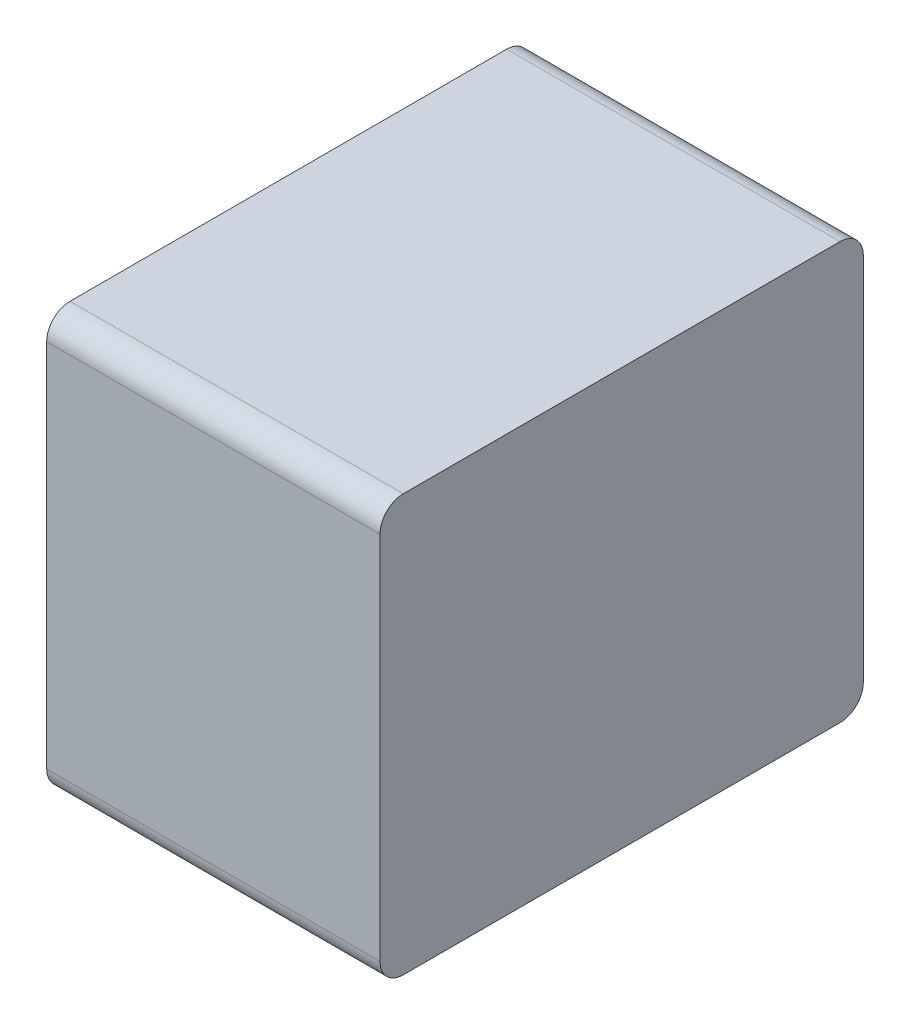
ISO-10303-21;
HEADER;
FILE_DESCRIPTION(('STEP AP214'),'2;1');
FILE_NAME('part.step','',(''),(''),'','','');
FILE_SCHEMA(('AUTOMOTIVE_DESIGN { 1 0 10303 214 1 1 1 1 }'));
ENDSEC;
DATA;
#1=APPLICATION_CONTEXT('core data for automotive mechanical design processes');
#2=APPLICATION_PROTOCOL_DEFINITION('international standard','automotive_design',2000,#1);
#3=PRODUCT_CONTEXT('',#1,'mechanical');
#4=PRODUCT('Part','Part','',(#3));
#5=PRODUCT_RELATED_PRODUCT_CATEGORY('part','',(#4));
#6=PRODUCT_DEFINITION_FORMATION('','',#4);
#7=PRODUCT_DEFINITION_CONTEXT('part definition',#1,'design');
#8=PRODUCT_DEFINITION('design','',#6,#7);
#9=PRODUCT_DEFINITION_SHAPE('','',#8);
#10=(LENGTH_UNIT() NAMED_UNIT(*) SI_UNIT(.MILLI.,.METRE.));
#11=(NAMED_UNIT(*) PLANE_ANGLE_UNIT() SI_UNIT($,.RADIAN.));
#12=(NAMED_UNIT(*) SI_UNIT($,.STERADIAN.) SOLID_ANGLE_UNIT());
#13=UNCERTAINTY_MEASURE_WITH_UNIT(LENGTH_MEASURE(1.E-05),#10,'distance_accuracy_value','');
#14=(GEOMETRIC_REPRESENTATION_CONTEXT(3) GLOBAL_UNCERTAINTY_ASSIGNED_CONTEXT((#13)) GLOBAL_UNIT_ASSIGNED_CONTEXT((#10,
#11,#12)) REPRESENTATION_CONTEXT('',''));
#15=CARTESIAN_POINT('',(0.,0.,0.));
#16=DIRECTION('',(0.,0.,1.));
#17=DIRECTION('',(1.,0.,0.));
#18=AXIS2_PLACEMENT_3D('',#15,#16,#17);
#19=CARTESIAN_POINT('',(13.800002391758,3.300002498851,-2.336602067947));
#20=DIRECTION('',(-0.999999999999996,8.74227765734797E-08,0.));
#21=DIRECTION('',(-8.74227765734797E-08,-0.999999999999996,0.));
#22=AXIS2_PLACEMENT_3D('',#19,#20,#21);
#23=PLANE('',#22);
#24=CARTESIAN_POINT('',(13.8000023432386,2.74500255611239,-2.991602116467));
#25=DIRECTION('',(0.999999999999996,-8.74227765734797E-08,0.));
#26=DIRECTION('',(8.74227765734797E-08,0.999999999999996,0.));
#27=AXIS2_PLACEMENT_3D('',#24,#25,#26);
#28=CIRCLE('',#27,0.07);
#29=CARTESIAN_POINT('',(13.800002337119,2.67500255611223,-2.9916021225868));
#30=VERTEX_POINT('',#29);
#31=CARTESIAN_POINT('',(13.8000023432383,2.7450025185205,-3.061602116467));
#32=VERTEX_POINT('',#31);
#33=EDGE_CURVE('E101',#30,#32,#28,.T.);
#34=ORIENTED_EDGE('',*,*,#33,.F.);
#35=DIRECTION('',(0.,8.74227766794096E-08,-0.999999999999996));
#36=VECTOR('',#35,1.);
#37=CARTESIAN_POINT('',(13.800002337119,2.67500244158839,-1.681602122587));
#38=LINE('',#37,#36);
#39=CARTESIAN_POINT('',(13.8000023371187,2.67500244158839,-1.6816021225868));
#40=VERTEX_POINT('',#39);
#41=EDGE_CURVE('E83',#40,#30,#38,.T.);
#42=ORIENTED_EDGE('',*,*,#41,.F.);
#43=CARTESIAN_POINT('',(13.800002343238,2.74500244158839,-1.681602116467));
#44=DIRECTION('',(0.999999999999996,-8.74227765734797E-08,0.));
#45=DIRECTION('',(8.74227765734797E-08,0.999999999999996,0.));
#46=AXIS2_PLACEMENT_3D('',#43,#44,#45);
#47=CIRCLE('',#46,0.07);
#48=CARTESIAN_POINT('',(13.8000023917575,2.74500243546878,-1.61160211646721));
#49=VERTEX_POINT('',#48);
#50=EDGE_CURVE('E20',#40,#49,#47,.F.);
#51=ORIENTED_EDGE('',*,*,#50,.T.);
#52=DIRECTION('',(0.,-0.999999999999996,-8.74227765851997E-08));
#53=VECTOR('',#52,1.);
#54=CARTESIAN_POINT('',(13.800002440277,3.855002391758,-1.611602019428));
#55=LINE('',#54,#53);
#56=CARTESIAN_POINT('',(13.8000024402772,3.8550023917575,-1.611602019428));
#57=VERTEX_POINT('',#56);
#58=EDGE_CURVE('E80',#57,#49,#55,.T.);
#59=ORIENTED_EDGE('',*,*,#58,.F.);
#60=CARTESIAN_POINT('',(13.8000024402774,3.85500244158839,-1.681602019428));
#61=DIRECTION('',(0.999999999999996,-8.74227765734797E-08,0.));
#62=DIRECTION('',(8.74227765734797E-08,0.999999999999996,0.));
#63=AXIS2_PLACEMENT_3D('',#60,#61,#62);
#64=CIRCLE('',#63,0.07);
#65=CARTESIAN_POINT('',(13.800002446397,3.92500244158855,-1.6816020133082));
#66=VERTEX_POINT('',#65);
#67=EDGE_CURVE('E113',#66,#57,#64,.T.);
#68=ORIENTED_EDGE('',*,*,#67,.F.);
#69=DIRECTION('',(0.,-8.74227765734797E-08,0.999999999999996));
#70=VECTOR('',#69,1.);
#71=CARTESIAN_POINT('',(13.800002446397,3.92500255611239,-2.991602013308));
#72=LINE('',#71,#70);
#73=CARTESIAN_POINT('',(13.8000024463968,3.92500255611239,-2.9916020163682));
#74=VERTEX_POINT('',#73);
#75=EDGE_CURVE('E110',#74,#66,#72,.T.);
#76=ORIENTED_EDGE('',*,*,#75,.F.);
#77=CARTESIAN_POINT('',(13.800002440277,3.85500255611239,-2.991602019428));
#78=DIRECTION('',(0.999999999999996,-8.74227765734797E-08,0.));
#79=DIRECTION('',(8.74227765734797E-08,0.999999999999996,0.));
#80=AXIS2_PLACEMENT_3D('',#77,#78,#79);
#81=CIRCLE('',#80,0.07);
#82=CARTESIAN_POINT('',(13.8000023917575,3.85500256223189,-3.06160201942786));
#83=VERTEX_POINT('',#82);
#84=EDGE_CURVE('E107',#83,#74,#81,.T.);
#85=ORIENTED_EDGE('',*,*,#84,.F.);
#86=DIRECTION('',(0.,0.999999999999996,8.74227765734797E-08));
#87=VECTOR('',#86,1.);
#88=CARTESIAN_POINT('',(13.800002343238,2.745002518521,-3.061602116467));
#89=LINE('',#88,#87);
#90=EDGE_CURVE('E104',#32,#83,#89,.T.);
#91=ORIENTED_EDGE('',*,*,#90,.F.);
#92=EDGE_LOOP('',(#34,#42,#51,#59,#68,#76,#85,#91));
#93=FACE_BOUND('',#92,.T.);
#94=ADVANCED_FACE('F17',(#93),#23,.T.);
#95=CARTESIAN_POINT('',(14.300002440277,3.855002391758,-1.611602019428));
#96=DIRECTION('',(0.,-8.74227765851997E-08,0.999999999999996));
#97=DIRECTION('',(0.,-0.999999999999996,-8.74227765851997E-08));
#98=AXIS2_PLACEMENT_3D('',#95,#96,#97);
#99=PLANE('',#98);
#100=DIRECTION('',(0.999999999999996,-8.74227765734797E-08,0.));
#101=VECTOR('',#100,1.);
#102=CARTESIAN_POINT('',(14.300002440277,3.85500239175761,-1.611602019428));
#103=LINE('',#102,#101);
#104=CARTESIAN_POINT('',(14.800002440277,3.85500235110592,-1.6116020679475));
#105=VERTEX_POINT('',#104);
#106=EDGE_CURVE('E90',#57,#105,#103,.T.);
#107=ORIENTED_EDGE('',*,*,#106,.F.);
#108=ORIENTED_EDGE('',*,*,#58,.T.);
#109=DIRECTION('',(0.999999999999996,-8.74227765734797E-08,0.));
#110=VECTOR('',#109,1.);
#111=CARTESIAN_POINT('',(14.300002343238,2.74500239175739,-1.611602116467));
#112=LINE('',#111,#110);
#113=CARTESIAN_POINT('',(14.8000023432385,2.74500235110581,-1.611602116467));
#114=VERTEX_POINT('',#113);
#115=EDGE_CURVE('E89',#114,#49,#112,.F.);
#116=ORIENTED_EDGE('',*,*,#115,.F.);
#117=DIRECTION('',(-8.74227765734797E-08,-0.999999999999996,0.));
#118=VECTOR('',#117,1.);
#119=CARTESIAN_POINT('',(14.800002391758,3.300002411428,-1.611602116467));
#120=LINE('',#119,#118);
#121=EDGE_CURVE('E93',#114,#105,#120,.F.);
#122=ORIENTED_EDGE('',*,*,#121,.T.);
#123=EDGE_LOOP('',(#107,#108,#116,#122));
#124=FACE_BOUND('',#123,.T.);
#125=ADVANCED_FACE('F87',(#124),#99,.T.);
#126=CARTESIAN_POINT('',(14.300002440277,3.855002397877,-1.681602019428));
#127=DIRECTION('',(0.999999999999996,-8.74227765734797E-08,0.));
#128=DIRECTION('',(8.74227765734797E-08,0.999999999999996,0.));
#129=AXIS2_PLACEMENT_3D('',#126,#127,#128);
#130=CYLINDRICAL_SURFACE('',#129,0.07);
#131=DIRECTION('',(0.999999999999996,-8.7422776573479E-08,0.));
#132=VECTOR('',#131,1.);
#133=CARTESIAN_POINT('',(14.300002446397,3.92500239787716,-1.681602013308));
#134=LINE('',#133,#132);
#135=CARTESIAN_POINT('',(14.8000024463969,3.92500235416594,-1.68160201636801));
#136=VERTEX_POINT('',#135);
#137=EDGE_CURVE('E111',#66,#136,#134,.T.);
#138=ORIENTED_EDGE('',*,*,#137,.F.);
#139=ORIENTED_EDGE('',*,*,#67,.T.);
#140=ORIENTED_EDGE('',*,*,#106,.T.);
#141=CARTESIAN_POINT('',(14.800002440277,3.85500235416561,-1.681602019428));
#142=DIRECTION('',(0.999999999999996,-8.74227765734797E-08,0.));
#143=DIRECTION('',(8.74227765734797E-08,0.999999999999996,0.));
#144=AXIS2_PLACEMENT_3D('',#141,#142,#143);
#145=CIRCLE('',#144,0.07);
#146=EDGE_CURVE('E95',#105,#136,#145,.F.);
#147=ORIENTED_EDGE('',*,*,#146,.T.);
#148=EDGE_LOOP('',(#138,#139,#140,#147));
#149=FACE_BOUND('',#148,.T.);
#150=ADVANCED_FACE('F135',(#149),#130,.T.);
#151=CARTESIAN_POINT('',(14.300002446397,3.925002512401,-2.991602013308));
#152=DIRECTION('',(8.74227765734793E-08,0.999999999999992,8.74227765734793E-08));
#153=DIRECTION('',(0.,-8.74227765734797E-08,0.999999999999996));
#154=AXIS2_PLACEMENT_3D('',#151,#152,#153);
#155=PLANE('',#154);
#156=DIRECTION('',(0.999999999999996,-8.74227765734797E-08,0.));
#157=VECTOR('',#156,1.);
#158=CARTESIAN_POINT('',(14.3000024463966,3.925002512401,-2.991602019428));
#159=LINE('',#158,#157);
#160=CARTESIAN_POINT('',(14.800002446397,3.92500241142781,-2.991602019428));
#161=VERTEX_POINT('',#160);
#162=EDGE_CURVE('E108',#74,#161,#159,.T.);
#163=ORIENTED_EDGE('',*,*,#162,.F.);
#164=ORIENTED_EDGE('',*,*,#75,.T.);
#165=ORIENTED_EDGE('',*,*,#137,.T.);
#166=DIRECTION('',(0.,0.,1.));
#167=VECTOR('',#166,1.);
#168=CARTESIAN_POINT('',(14.8000024463972,3.925002354166,-2.336602067947));
#169=LINE('',#168,#167);
#170=EDGE_CURVE('E127',#136,#161,#169,.F.);
#171=ORIENTED_EDGE('',*,*,#170,.T.);
#172=EDGE_LOOP('',(#163,#164,#165,#171));
#173=FACE_BOUND('',#172,.T.);
#174=ADVANCED_FACE('F139',(#173),#155,.T.);
#175=CARTESIAN_POINT('',(14.300002440277,3.855002512401,-2.991602019428));
#176=DIRECTION('',(0.999999999999996,-8.74227765734797E-08,0.));
#177=DIRECTION('',(8.74227765734797E-08,0.999999999999996,0.));
#178=AXIS2_PLACEMENT_3D('',#175,#176,#177);
#179=CYLINDRICAL_SURFACE('',#178,0.07);
#180=DIRECTION('',(1.,0.,0.));
#181=VECTOR('',#180,1.);
#182=CARTESIAN_POINT('',(14.300002343238,3.855002562232,-3.06160201942771));
#183=LINE('',#182,#181);
#184=CARTESIAN_POINT('',(14.8000024402774,3.85500251546081,-3.06160201942786));
#185=VERTEX_POINT('',#184);
#186=EDGE_CURVE('E105',#83,#185,#183,.T.);
#187=ORIENTED_EDGE('',*,*,#186,.F.);
#188=ORIENTED_EDGE('',*,*,#84,.T.);
#189=ORIENTED_EDGE('',*,*,#162,.T.);
#190=CARTESIAN_POINT('',(14.8000024402774,3.85500246868961,-2.991602019428));
#191=DIRECTION('',(0.999999999999996,-8.74227765734797E-08,0.));
#192=DIRECTION('',(8.74227765734797E-08,0.999999999999996,0.));
#193=AXIS2_PLACEMENT_3D('',#190,#191,#192);
#194=CIRCLE('',#193,0.07);
#195=EDGE_CURVE('E124',#161,#185,#194,.F.);
#196=ORIENTED_EDGE('',*,*,#195,.T.);
#197=EDGE_LOOP('',(#187,#188,#189,#196));
#198=FACE_BOUND('',#197,.T.);
#199=ADVANCED_FACE('F145',(#198),#179,.T.);
#200=CARTESIAN_POINT('',(14.300002343238,2.745002518521,-3.061602116467));
#201=DIRECTION('',(0.,8.74227765734797E-08,-0.999999999999996));
#202=DIRECTION('',(0.,0.999999999999996,8.74227765734797E-08));
#203=AXIS2_PLACEMENT_3D('',#200,#201,#202);
#204=PLANE('',#203);
#205=DIRECTION('',(0.999999999999996,-8.74227765734797E-08,0.));
#206=VECTOR('',#205,1.);
#207=CARTESIAN_POINT('',(14.300002343238,2.74500251852061,-3.061602116467));
#208=LINE('',#207,#206);
#209=CARTESIAN_POINT('',(14.800002343238,2.74500247174942,-3.0616020679475));
#210=VERTEX_POINT('',#209);
#211=EDGE_CURVE('E102',#32,#210,#208,.T.);
#212=ORIENTED_EDGE('',*,*,#211,.F.);
#213=ORIENTED_EDGE('',*,*,#90,.T.);
#214=ORIENTED_EDGE('',*,*,#186,.T.);
#215=DIRECTION('',(-8.74227765734797E-08,-0.999999999999996,0.));
#216=VECTOR('',#215,1.);
#217=CARTESIAN_POINT('',(14.800002391758,3.300002411428,-3.061602019428));
#218=LINE('',#217,#216);
#219=EDGE_CURVE('E123',#185,#210,#218,.T.);
#220=ORIENTED_EDGE('',*,*,#219,.T.);
#221=EDGE_LOOP('',(#212,#213,#214,#220));
#222=FACE_BOUND('',#221,.T.);
#223=ADVANCED_FACE('F163',(#222),#204,.T.);
#224=CARTESIAN_POINT('',(14.300002343238,2.745002512401,-2.991602116467));
#225=DIRECTION('',(0.999999999999996,-8.74227765734797E-08,0.));
#226=DIRECTION('',(8.74227765734797E-08,0.999999999999996,0.));
#227=AXIS2_PLACEMENT_3D('',#224,#225,#226);
#228=CYLINDRICAL_SURFACE('',#227,0.07);
#229=DIRECTION('',(0.999999999999996,-8.7422776573479E-08,0.));
#230=VECTOR('',#229,1.);
#231=CARTESIAN_POINT('',(14.300002337119,2.67500251240084,-2.991602122587));
#232=LINE('',#231,#230);
#233=CARTESIAN_POINT('',(14.8000023371184,2.67500246868972,-2.99160211952701));
#234=VERTEX_POINT('',#233);
#235=EDGE_CURVE('E99',#30,#234,#232,.T.);
#236=ORIENTED_EDGE('',*,*,#235,.F.);
#237=ORIENTED_EDGE('',*,*,#33,.T.);
#238=ORIENTED_EDGE('',*,*,#211,.T.);
#239=CARTESIAN_POINT('',(14.800002343238,2.74500246868961,-2.991602116467));
#240=DIRECTION('',(0.999999999999996,-8.74227765734797E-08,0.));
#241=DIRECTION('',(8.74227765734797E-08,0.999999999999996,0.));
#242=AXIS2_PLACEMENT_3D('',#239,#240,#241);
#243=CIRCLE('',#242,0.07);
#244=EDGE_CURVE('E120',#210,#234,#243,.F.);
#245=ORIENTED_EDGE('',*,*,#244,.T.);
#246=EDGE_LOOP('',(#236,#237,#238,#245));
#247=FACE_BOUND('',#246,.T.);
#248=ADVANCED_FACE('F162',(#247),#228,.T.);
#249=CARTESIAN_POINT('',(14.300002337119,2.675002397877,-1.681602122587));
#250=DIRECTION('',(-8.74227765734793E-08,-0.999999999999992,-8.74227766794093E-08));
#251=DIRECTION('',(0.,8.74227766794096E-08,-0.999999999999996));
#252=AXIS2_PLACEMENT_3D('',#249,#250,#251);
#253=PLANE('',#252);
#254=DIRECTION('',(0.999999999999996,-8.74227765734797E-08,0.));
#255=VECTOR('',#254,1.);
#256=CARTESIAN_POINT('',(14.3000023371184,2.675002397877,-1.681602122587));
#257=LINE('',#256,#255);
#258=CARTESIAN_POINT('',(14.800002337119,2.67500241142781,-1.68160211952701));
#259=VERTEX_POINT('',#258);
#260=EDGE_CURVE('E34',#40,#259,#257,.T.);
#261=ORIENTED_EDGE('',*,*,#260,.F.);
#262=ORIENTED_EDGE('',*,*,#41,.T.);
#263=ORIENTED_EDGE('',*,*,#235,.T.);
#264=DIRECTION('',(0.,0.,1.));
#265=VECTOR('',#264,1.);
#266=CARTESIAN_POINT('',(14.8000023371188,2.67500246869,-2.336602067947));
#267=LINE('',#266,#265);
#268=EDGE_CURVE('E26',#234,#259,#267,.T.);
#269=ORIENTED_EDGE('',*,*,#268,.T.);
#270=EDGE_LOOP('',(#261,#262,#263,#269));
#271=FACE_BOUND('',#270,.T.);
#272=ADVANCED_FACE('F159',(#271),#253,.T.);
#273=CARTESIAN_POINT('',(14.300002343238,2.745002397877,-1.681602116467));
#274=DIRECTION('',(0.999999999999996,-8.74227765734797E-08,0.));
#275=DIRECTION('',(8.74227765734797E-08,0.999999999999996,0.));
#276=AXIS2_PLACEMENT_3D('',#273,#274,#275);
#277=CYLINDRICAL_SURFACE('',#276,0.07);
#278=ORIENTED_EDGE('',*,*,#115,.T.);
#279=ORIENTED_EDGE('',*,*,#50,.F.);
#280=ORIENTED_EDGE('',*,*,#260,.T.);
#281=CARTESIAN_POINT('',(14.8000023432386,2.74500235416561,-1.681602116467));
#282=DIRECTION('',(0.999999999999996,-8.74227765734797E-08,0.));
#283=DIRECTION('',(8.74227765734797E-08,0.999999999999996,0.));
#284=AXIS2_PLACEMENT_3D('',#281,#282,#283);
#285=CIRCLE('',#284,0.07);
#286=EDGE_CURVE('E11',#259,#114,#285,.F.);
#287=ORIENTED_EDGE('',*,*,#286,.T.);
#288=EDGE_LOOP('',(#278,#279,#280,#287));
#289=FACE_BOUND('',#288,.T.);
#290=ADVANCED_FACE('F92',(#289),#277,.T.);
#291=CARTESIAN_POINT('',(14.800002391758,3.300002411428,-2.336602067947));
#292=DIRECTION('',(-0.999999999999996,8.74227765734797E-08,0.));
#293=DIRECTION('',(-8.74227765734797E-08,-0.999999999999996,0.));
#294=AXIS2_PLACEMENT_3D('',#291,#292,#293);
#295=PLANE('',#294);
#296=ORIENTED_EDGE('',*,*,#268,.F.);
#297=ORIENTED_EDGE('',*,*,#244,.F.);
#298=ORIENTED_EDGE('',*,*,#219,.F.);
#299=ORIENTED_EDGE('',*,*,#195,.F.);
#300=ORIENTED_EDGE('',*,*,#170,.F.);
#301=ORIENTED_EDGE('',*,*,#146,.F.);
#302=ORIENTED_EDGE('',*,*,#121,.F.);
#303=ORIENTED_EDGE('',*,*,#286,.F.);
#304=EDGE_LOOP('',(#296,#297,#298,#299,#300,#301,#302,#303));
#305=FACE_BOUND('',#304,.T.);
#306=ADVANCED_FACE('F149',(#305),#295,.F.);
#307=CLOSED_SHELL('',(#94,#125,#150,#174,#199,#223,#248,#272,#290,#306));
#308=MANIFOLD_SOLID_BREP('B1',#307);
#309=ADVANCED_BREP_SHAPE_REPRESENTATION('',(#18,#308),#14);
#310=SHAPE_DEFINITION_REPRESENTATION(#9,#309);
ENDSEC;
END-ISO-10303-21;
